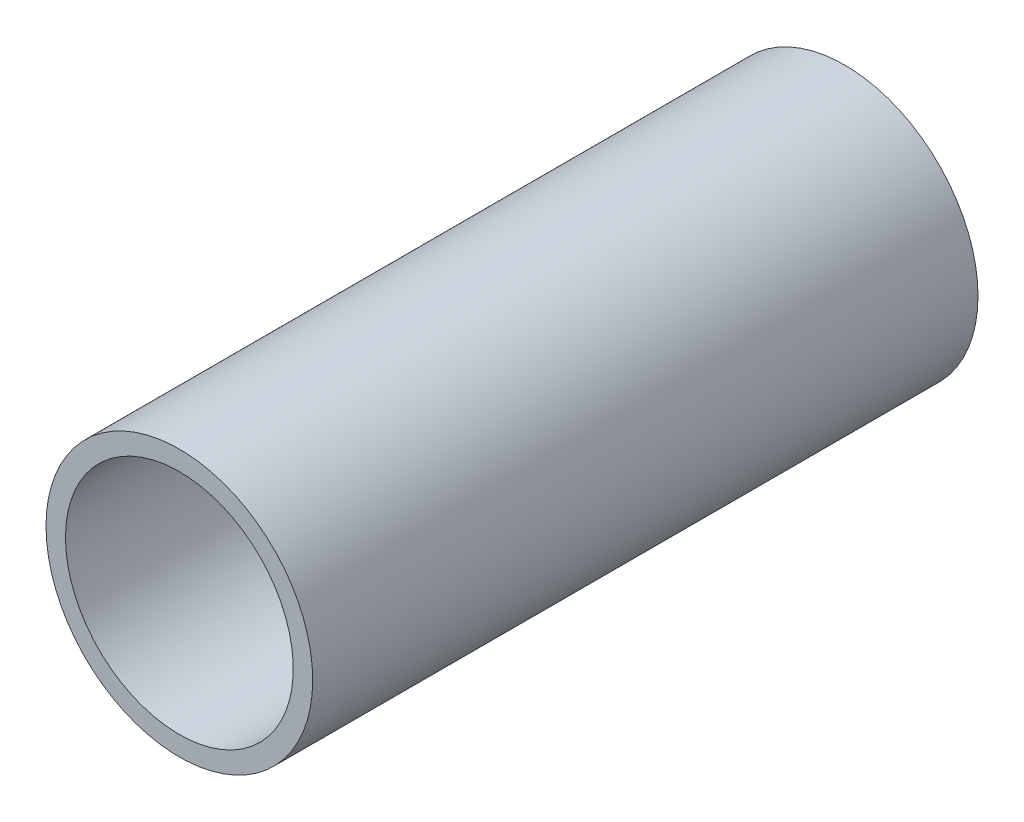
ISO-10303-21;
HEADER;
FILE_DESCRIPTION(('STEP AP214'),'2;1');
FILE_NAME('part.step','',(''),(''),'','','');
FILE_SCHEMA(('AUTOMOTIVE_DESIGN { 1 0 10303 214 1 1 1 1 }'));
ENDSEC;
DATA;
#1=APPLICATION_CONTEXT('core data for automotive mechanical design processes');
#2=APPLICATION_PROTOCOL_DEFINITION('international standard','automotive_design',2000,#1);
#3=PRODUCT_CONTEXT('',#1,'mechanical');
#4=PRODUCT('Part','Part','',(#3));
#5=PRODUCT_RELATED_PRODUCT_CATEGORY('part','',(#4));
#6=PRODUCT_DEFINITION_FORMATION('','',#4);
#7=PRODUCT_DEFINITION_CONTEXT('part definition',#1,'design');
#8=PRODUCT_DEFINITION('design','',#6,#7);
#9=PRODUCT_DEFINITION_SHAPE('','',#8);
#10=(LENGTH_UNIT() NAMED_UNIT(*) SI_UNIT(.MILLI.,.METRE.));
#11=(NAMED_UNIT(*) PLANE_ANGLE_UNIT() SI_UNIT($,.RADIAN.));
#12=(NAMED_UNIT(*) SI_UNIT($,.STERADIAN.) SOLID_ANGLE_UNIT());
#13=UNCERTAINTY_MEASURE_WITH_UNIT(LENGTH_MEASURE(1.E-05),#10,'distance_accuracy_value','');
#14=(GEOMETRIC_REPRESENTATION_CONTEXT(3) GLOBAL_UNCERTAINTY_ASSIGNED_CONTEXT((#13)) GLOBAL_UNIT_ASSIGNED_CONTEXT((#10,
#11,#12)) REPRESENTATION_CONTEXT('',''));
#15=CARTESIAN_POINT('',(0.,0.,0.));
#16=DIRECTION('',(0.,0.,1.));
#17=DIRECTION('',(1.,0.,0.));
#18=AXIS2_PLACEMENT_3D('',#15,#16,#17);
#19=CARTESIAN_POINT('',(0.,0.,223.));
#20=DIRECTION('',(0.,0.,1.));
#21=DIRECTION('',(1.,0.,0.));
#22=AXIS2_PLACEMENT_3D('',#19,#20,#21);
#23=PLANE('',#22);
#24=CARTESIAN_POINT('',(0.,0.,223.));
#25=DIRECTION('',(0.,0.,1.));
#26=DIRECTION('',(1.,0.,0.));
#27=AXIS2_PLACEMENT_3D('',#24,#25,#26);
#28=CIRCLE('',#27,44.7);
#29=CARTESIAN_POINT('',(-44.7,0.,223.));
#30=VERTEX_POINT('',#29);
#31=EDGE_CURVE('E10',#30,#30,#28,.T.);
#32=ORIENTED_EDGE('',*,*,#31,.T.);
#33=EDGE_LOOP('',(#32));
#34=FACE_BOUND('',#33,.T.);
#35=CARTESIAN_POINT('',(0.,0.,223.));
#36=DIRECTION('',(0.,0.,1.));
#37=DIRECTION('',(1.,0.,0.));
#38=AXIS2_PLACEMENT_3D('',#35,#36,#37);
#39=CIRCLE('',#38,38.17);
#40=CARTESIAN_POINT('',(-38.17,0.,223.));
#41=VERTEX_POINT('',#40);
#42=EDGE_CURVE('E42',#41,#41,#39,.T.);
#43=ORIENTED_EDGE('',*,*,#42,.F.);
#44=EDGE_LOOP('',(#43));
#45=FACE_BOUND('',#44,.T.);
#46=ADVANCED_FACE('F31',(#34,#45),#23,.T.);
#47=CARTESIAN_POINT('',(0.,0.,0.));
#48=DIRECTION('',(0.,0.,1.));
#49=DIRECTION('',(1.,0.,0.));
#50=AXIS2_PLACEMENT_3D('',#47,#48,#49);
#51=PLANE('',#50);
#52=CARTESIAN_POINT('',(0.,0.,0.));
#53=DIRECTION('',(0.,0.,1.));
#54=DIRECTION('',(1.,0.,0.));
#55=AXIS2_PLACEMENT_3D('',#52,#53,#54);
#56=CIRCLE('',#55,44.7);
#57=CARTESIAN_POINT('',(-44.7,0.,0.));
#58=VERTEX_POINT('',#57);
#59=EDGE_CURVE('E35',#58,#58,#56,.T.);
#60=ORIENTED_EDGE('',*,*,#59,.F.);
#61=EDGE_LOOP('',(#60));
#62=FACE_BOUND('',#61,.T.);
#63=CARTESIAN_POINT('',(0.,0.,0.));
#64=DIRECTION('',(0.,0.,1.));
#65=DIRECTION('',(1.,0.,0.));
#66=AXIS2_PLACEMENT_3D('',#63,#64,#65);
#67=CIRCLE('',#66,38.17);
#68=CARTESIAN_POINT('',(-38.17,0.,0.));
#69=VERTEX_POINT('',#68);
#70=EDGE_CURVE('E44',#69,#69,#67,.T.);
#71=ORIENTED_EDGE('',*,*,#70,.T.);
#72=EDGE_LOOP('',(#71));
#73=FACE_BOUND('',#72,.T.);
#74=ADVANCED_FACE('F54',(#62,#73),#51,.F.);
#75=CARTESIAN_POINT('',(0.,0.,223.));
#76=DIRECTION('',(0.,0.,-1.));
#77=DIRECTION('',(-1.,0.,0.));
#78=AXIS2_PLACEMENT_3D('',#75,#76,#77);
#79=CYLINDRICAL_SURFACE('',#78,44.7);
#80=CARTESIAN_POINT('',(-44.7,0.,223.));
#81=CARTESIAN_POINT('',(-44.7,0.,220.677083333333));
#82=CARTESIAN_POINT('',(-44.7,0.,218.354166666667));
#83=CARTESIAN_POINT('',(-44.7,0.,213.708333333333));
#84=CARTESIAN_POINT('',(-44.7,0.,211.385416666667));
#85=CARTESIAN_POINT('',(-44.7,0.,206.739583333333));
#86=CARTESIAN_POINT('',(-44.7,0.,204.416666666667));
#87=CARTESIAN_POINT('',(-44.7,0.,199.770833333333));
#88=CARTESIAN_POINT('',(-44.7,0.,197.447916666667));
#89=CARTESIAN_POINT('',(-44.7,0.,192.802083333333));
#90=CARTESIAN_POINT('',(-44.7,0.,190.479166666667));
#91=CARTESIAN_POINT('',(-44.7,0.,185.833333333333));
#92=CARTESIAN_POINT('',(-44.7,0.,183.510416666667));
#93=CARTESIAN_POINT('',(-44.7,0.,178.864583333333));
#94=CARTESIAN_POINT('',(-44.7,0.,176.541666666667));
#95=CARTESIAN_POINT('',(-44.7,0.,171.895833333333));
#96=CARTESIAN_POINT('',(-44.7,0.,169.572916666667));
#97=CARTESIAN_POINT('',(-44.7,0.,164.927083333333));
#98=CARTESIAN_POINT('',(-44.7,0.,162.604166666667));
#99=CARTESIAN_POINT('',(-44.7,0.,157.958333333333));
#100=CARTESIAN_POINT('',(-44.7,0.,155.635416666667));
#101=CARTESIAN_POINT('',(-44.7,0.,150.989583333333));
#102=CARTESIAN_POINT('',(-44.7,0.,148.666666666667));
#103=CARTESIAN_POINT('',(-44.7,0.,144.020833333333));
#104=CARTESIAN_POINT('',(-44.7,0.,141.697916666667));
#105=CARTESIAN_POINT('',(-44.7,0.,137.052083333333));
#106=CARTESIAN_POINT('',(-44.7,0.,134.729166666667));
#107=CARTESIAN_POINT('',(-44.7,0.,130.083333333333));
#108=CARTESIAN_POINT('',(-44.7,0.,127.760416666667));
#109=CARTESIAN_POINT('',(-44.7,0.,123.114583333333));
#110=CARTESIAN_POINT('',(-44.7,0.,120.791666666667));
#111=CARTESIAN_POINT('',(-44.7,0.,116.145833333333));
#112=CARTESIAN_POINT('',(-44.7,0.,113.822916666667));
#113=CARTESIAN_POINT('',(-44.7,0.,109.177083333333));
#114=CARTESIAN_POINT('',(-44.7,0.,106.854166666667));
#115=CARTESIAN_POINT('',(-44.7,0.,102.208333333333));
#116=CARTESIAN_POINT('',(-44.7,0.,99.8854166666667));
#117=CARTESIAN_POINT('',(-44.7,0.,95.2395833333333));
#118=CARTESIAN_POINT('',(-44.7,0.,92.9166666666667));
#119=CARTESIAN_POINT('',(-44.7,0.,88.2708333333333));
#120=CARTESIAN_POINT('',(-44.7,0.,85.9479166666667));
#121=CARTESIAN_POINT('',(-44.7,0.,81.3020833333333));
#122=CARTESIAN_POINT('',(-44.7,0.,78.9791666666667));
#123=CARTESIAN_POINT('',(-44.7,0.,74.3333333333333));
#124=CARTESIAN_POINT('',(-44.7,0.,72.0104166666667));
#125=CARTESIAN_POINT('',(-44.7,0.,67.3645833333333));
#126=CARTESIAN_POINT('',(-44.7,0.,65.0416666666667));
#127=CARTESIAN_POINT('',(-44.7,0.,60.3958333333333));
#128=CARTESIAN_POINT('',(-44.7,0.,58.0729166666667));
#129=CARTESIAN_POINT('',(-44.7,0.,53.4270833333333));
#130=CARTESIAN_POINT('',(-44.7,0.,51.1041666666667));
#131=CARTESIAN_POINT('',(-44.7,0.,46.4583333333333));
#132=CARTESIAN_POINT('',(-44.7,0.,44.1354166666667));
#133=CARTESIAN_POINT('',(-44.7,0.,39.4895833333333));
#134=CARTESIAN_POINT('',(-44.7,0.,37.1666666666667));
#135=CARTESIAN_POINT('',(-44.7,0.,32.5208333333333));
#136=CARTESIAN_POINT('',(-44.7,0.,30.1979166666667));
#137=CARTESIAN_POINT('',(-44.7,0.,25.5520833333333));
#138=CARTESIAN_POINT('',(-44.7,0.,23.2291666666667));
#139=CARTESIAN_POINT('',(-44.7,0.,18.5833333333333));
#140=CARTESIAN_POINT('',(-44.7,0.,16.2604166666667));
#141=CARTESIAN_POINT('',(-44.7,0.,11.6145833333333));
#142=CARTESIAN_POINT('',(-44.7,0.,9.29166666666666));
#143=CARTESIAN_POINT('',(-44.7,0.,4.64583333333333));
#144=CARTESIAN_POINT('',(-44.7,0.,2.32291666666666));
#145=CARTESIAN_POINT('',(-44.7,0.,0.));
#146=B_SPLINE_CURVE_WITH_KNOTS('',3,(#80,#81,#82,#83,#84,#85,#86,#87,#88,#89,#90,#91,#92,#93,
#94,#95,#96,#97,#98,#99,#100,#101,#102,#103,#104,#105,#106,#107,#108,#109,#110,#111,#112,#113,
#114,#115,#116,#117,#118,#119,#120,#121,#122,#123,#124,#125,#126,#127,#128,#129,#130,#131,#132,
#133,#134,#135,#136,#137,#138,#139,#140,#141,#142,#143,#144,#145),.UNSPECIFIED.,.F.,.F.,(4,2,2,
2,2,2,2,2,2,2,2,2,2,2,2,2,2,2,2,2,2,2,2,2,2,2,2,2,2,2,2,2,4),(0.,6.96875,13.9375,20.90625,
27.875,34.84375,41.8125,48.78125,55.75,62.71875,69.6875,76.65625,83.625,90.59375,97.5625,
104.53125,111.5,118.46875,125.4375,132.40625,139.375,146.34375,153.3125,160.28125,167.25,
174.21875,181.1875,188.15625,195.125,202.09375,209.0625,216.03125,223.),.UNSPECIFIED.);
#147=EDGE_CURVE('BSEAM33',#30,#58,#146,.T.);
#148=ORIENTED_EDGE('',*,*,#31,.F.);
#149=ORIENTED_EDGE('',*,*,#59,.T.);
#150=ORIENTED_EDGE('',*,*,#147,.T.);
#151=ORIENTED_EDGE('',*,*,#147,.F.);
#152=EDGE_LOOP('',(#148,#150,#149,#151));
#153=FACE_BOUND('',#152,.T.);
#154=ADVANCED_FACE('F33',(#153),#79,.T.);
#155=CARTESIAN_POINT('',(0.,0.,223.));
#156=DIRECTION('',(0.,0.,-1.));
#157=DIRECTION('',(-1.,0.,0.));
#158=AXIS2_PLACEMENT_3D('',#155,#156,#157);
#159=CYLINDRICAL_SURFACE('',#158,38.17);
#160=CARTESIAN_POINT('',(-38.17,0.,223.));
#161=CARTESIAN_POINT('',(-38.17,0.,220.677083333333));
#162=CARTESIAN_POINT('',(-38.17,0.,218.354166666667));
#163=CARTESIAN_POINT('',(-38.17,0.,213.708333333333));
#164=CARTESIAN_POINT('',(-38.17,0.,211.385416666667));
#165=CARTESIAN_POINT('',(-38.17,0.,206.739583333333));
#166=CARTESIAN_POINT('',(-38.17,0.,204.416666666667));
#167=CARTESIAN_POINT('',(-38.17,0.,199.770833333333));
#168=CARTESIAN_POINT('',(-38.17,0.,197.447916666667));
#169=CARTESIAN_POINT('',(-38.17,0.,192.802083333333));
#170=CARTESIAN_POINT('',(-38.17,0.,190.479166666667));
#171=CARTESIAN_POINT('',(-38.17,0.,185.833333333333));
#172=CARTESIAN_POINT('',(-38.17,0.,183.510416666667));
#173=CARTESIAN_POINT('',(-38.17,0.,178.864583333333));
#174=CARTESIAN_POINT('',(-38.17,0.,176.541666666667));
#175=CARTESIAN_POINT('',(-38.17,0.,171.895833333333));
#176=CARTESIAN_POINT('',(-38.17,0.,169.572916666667));
#177=CARTESIAN_POINT('',(-38.17,0.,164.927083333333));
#178=CARTESIAN_POINT('',(-38.17,0.,162.604166666667));
#179=CARTESIAN_POINT('',(-38.17,0.,157.958333333333));
#180=CARTESIAN_POINT('',(-38.17,0.,155.635416666667));
#181=CARTESIAN_POINT('',(-38.17,0.,150.989583333333));
#182=CARTESIAN_POINT('',(-38.17,0.,148.666666666667));
#183=CARTESIAN_POINT('',(-38.17,0.,144.020833333333));
#184=CARTESIAN_POINT('',(-38.17,0.,141.697916666667));
#185=CARTESIAN_POINT('',(-38.17,0.,137.052083333333));
#186=CARTESIAN_POINT('',(-38.17,0.,134.729166666667));
#187=CARTESIAN_POINT('',(-38.17,0.,130.083333333333));
#188=CARTESIAN_POINT('',(-38.17,0.,127.760416666667));
#189=CARTESIAN_POINT('',(-38.17,0.,123.114583333333));
#190=CARTESIAN_POINT('',(-38.17,0.,120.791666666667));
#191=CARTESIAN_POINT('',(-38.17,0.,116.145833333333));
#192=CARTESIAN_POINT('',(-38.17,0.,113.822916666667));
#193=CARTESIAN_POINT('',(-38.17,0.,109.177083333333));
#194=CARTESIAN_POINT('',(-38.17,0.,106.854166666667));
#195=CARTESIAN_POINT('',(-38.17,0.,102.208333333333));
#196=CARTESIAN_POINT('',(-38.17,0.,99.8854166666667));
#197=CARTESIAN_POINT('',(-38.17,0.,95.2395833333333));
#198=CARTESIAN_POINT('',(-38.17,0.,92.9166666666667));
#199=CARTESIAN_POINT('',(-38.17,0.,88.2708333333333));
#200=CARTESIAN_POINT('',(-38.17,0.,85.9479166666667));
#201=CARTESIAN_POINT('',(-38.17,0.,81.3020833333333));
#202=CARTESIAN_POINT('',(-38.17,0.,78.9791666666667));
#203=CARTESIAN_POINT('',(-38.17,0.,74.3333333333333));
#204=CARTESIAN_POINT('',(-38.17,0.,72.0104166666667));
#205=CARTESIAN_POINT('',(-38.17,0.,67.3645833333334));
#206=CARTESIAN_POINT('',(-38.17,0.,65.0416666666667));
#207=CARTESIAN_POINT('',(-38.17,0.,60.3958333333333));
#208=CARTESIAN_POINT('',(-38.17,0.,58.0729166666667));
#209=CARTESIAN_POINT('',(-38.17,0.,53.4270833333333));
#210=CARTESIAN_POINT('',(-38.17,0.,51.1041666666667));
#211=CARTESIAN_POINT('',(-38.17,0.,46.4583333333333));
#212=CARTESIAN_POINT('',(-38.17,0.,44.1354166666667));
#213=CARTESIAN_POINT('',(-38.17,0.,39.4895833333333));
#214=CARTESIAN_POINT('',(-38.17,0.,37.1666666666667));
#215=CARTESIAN_POINT('',(-38.17,0.,32.5208333333333));
#216=CARTESIAN_POINT('',(-38.17,0.,30.1979166666667));
#217=CARTESIAN_POINT('',(-38.17,0.,25.5520833333333));
#218=CARTESIAN_POINT('',(-38.17,0.,23.2291666666667));
#219=CARTESIAN_POINT('',(-38.17,0.,18.5833333333333));
#220=CARTESIAN_POINT('',(-38.17,0.,16.2604166666667));
#221=CARTESIAN_POINT('',(-38.17,0.,11.6145833333333));
#222=CARTESIAN_POINT('',(-38.17,0.,9.29166666666666));
#223=CARTESIAN_POINT('',(-38.17,0.,4.64583333333333));
#224=CARTESIAN_POINT('',(-38.17,0.,2.32291666666666));
#225=CARTESIAN_POINT('',(-38.17,0.,0.));
#226=B_SPLINE_CURVE_WITH_KNOTS('',3,(#160,#161,#162,#163,#164,#165,#166,#167,#168,#169,#170,
#171,#172,#173,#174,#175,#176,#177,#178,#179,#180,#181,#182,#183,#184,#185,#186,#187,#188,#189,
#190,#191,#192,#193,#194,#195,#196,#197,#198,#199,#200,#201,#202,#203,#204,#205,#206,#207,#208,
#209,#210,#211,#212,#213,#214,#215,#216,#217,#218,#219,#220,#221,#222,#223,#224,#225),
.UNSPECIFIED.,.F.,.F.,(4,2,2,2,2,2,2,2,2,2,2,2,2,2,2,2,2,2,2,2,2,2,2,2,2,2,2,2,2,2,2,2,4),(0.,
6.96875000000002,13.9375,20.90625,27.875,34.84375,41.8125,48.78125,55.75,62.71875,69.6875,
76.65625,83.625,90.59375,97.5625,104.53125,111.5,118.46875,125.4375,132.40625,139.375,146.34375,
153.3125,160.28125,167.25,174.21875,181.1875,188.15625,195.125,202.09375,209.0625,216.03125,
223.),.UNSPECIFIED.);
#227=EDGE_CURVE('BSEAM50',#41,#69,#226,.T.);
#228=ORIENTED_EDGE('',*,*,#42,.T.);
#229=ORIENTED_EDGE('',*,*,#70,.F.);
#230=ORIENTED_EDGE('',*,*,#227,.T.);
#231=ORIENTED_EDGE('',*,*,#227,.F.);
#232=EDGE_LOOP('',(#228,#230,#229,#231));
#233=FACE_BOUND('',#232,.T.);
#234=ADVANCED_FACE('F50',(#233),#159,.F.);
#235=CLOSED_SHELL('',(#46,#74,#154,#234));
#236=MANIFOLD_SOLID_BREP('B2',#235);
#237=ADVANCED_BREP_SHAPE_REPRESENTATION('',(#18,#236),#14);
#238=SHAPE_DEFINITION_REPRESENTATION(#9,#237);
ENDSEC;
END-ISO-10303-21;
